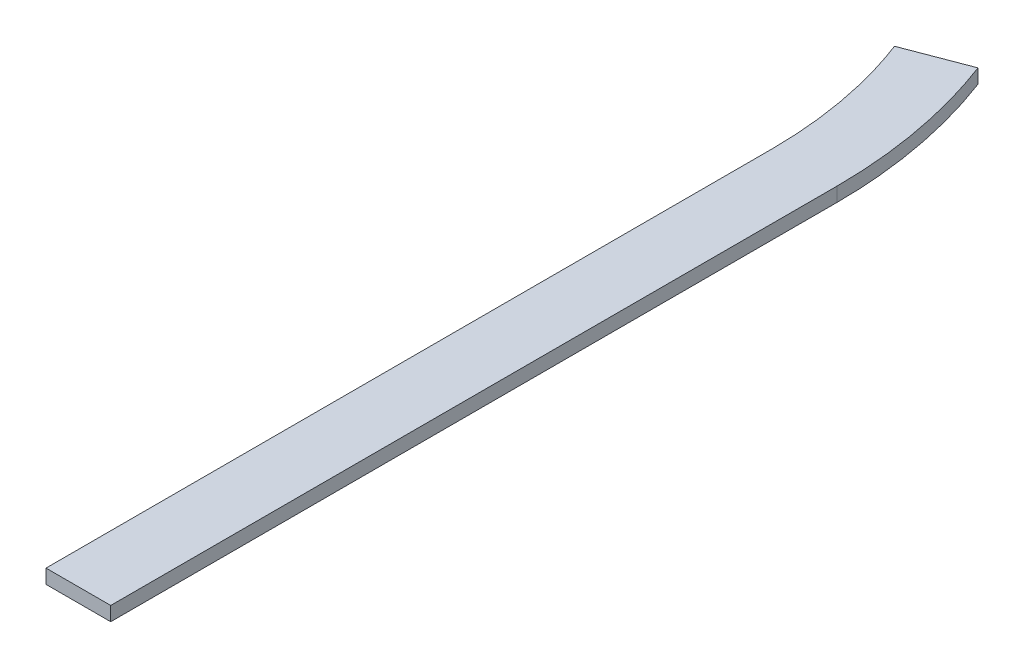
ISO-10303-21;
HEADER;
FILE_DESCRIPTION(('STEP AP214'),'2;1');
FILE_NAME('part.step','',(''),(''),'','','');
FILE_SCHEMA(('AUTOMOTIVE_DESIGN { 1 0 10303 214 1 1 1 1 }'));
ENDSEC;
DATA;
#1=APPLICATION_CONTEXT('core data for automotive mechanical design processes');
#2=APPLICATION_PROTOCOL_DEFINITION('international standard','automotive_design',2000,#1);
#3=PRODUCT_CONTEXT('',#1,'mechanical');
#4=PRODUCT('Part','Part','',(#3));
#5=PRODUCT_RELATED_PRODUCT_CATEGORY('part','',(#4));
#6=PRODUCT_DEFINITION_FORMATION('','',#4);
#7=PRODUCT_DEFINITION_CONTEXT('part definition',#1,'design');
#8=PRODUCT_DEFINITION('design','',#6,#7);
#9=PRODUCT_DEFINITION_SHAPE('','',#8);
#10=(LENGTH_UNIT() NAMED_UNIT(*) SI_UNIT(.MILLI.,.METRE.));
#11=(NAMED_UNIT(*) PLANE_ANGLE_UNIT() SI_UNIT($,.RADIAN.));
#12=(NAMED_UNIT(*) SI_UNIT($,.STERADIAN.) SOLID_ANGLE_UNIT());
#13=UNCERTAINTY_MEASURE_WITH_UNIT(LENGTH_MEASURE(1.E-05),#10,'distance_accuracy_value','');
#14=(GEOMETRIC_REPRESENTATION_CONTEXT(3) GLOBAL_UNCERTAINTY_ASSIGNED_CONTEXT((#13)) GLOBAL_UNIT_ASSIGNED_CONTEXT((#10,
#11,#12)) REPRESENTATION_CONTEXT('',''));
#15=CARTESIAN_POINT('',(0.,0.,0.));
#16=DIRECTION('',(0.,0.,1.));
#17=DIRECTION('',(1.,0.,0.));
#18=AXIS2_PLACEMENT_3D('',#15,#16,#17);
#19=CARTESIAN_POINT('',(206.7634030179,12.51982526687,-73.80424339814));
#20=DIRECTION('',(-4.11807596780088E-05,-0.999999999152071,4.96010211486386E-08));
#21=DIRECTION('',(0.999999999152072,-4.11807596780089E-05,0.));
#22=AXIS2_PLACEMENT_3D('',#19,#20,#21);
#23=PLANE('',#22);
#24=CARTESIAN_POINT('',(205.25,12.51990717558,-68.79760293847));
#25=DIRECTION('',(0.,3.85219138878227E-06,0.99999999999258));
#26=VECTOR('',#25,1.);
#27=LINE('',#24,#26);
#28=CARTESIAN_POINT('',(205.249996809574,12.5198978926762,-68.7976029384695));
#29=VERTEX_POINT('',#28);
#30=CARTESIAN_POINT('',(205.249999997882,12.5200060460964,-24.4496012181494));
#31=VERTEX_POINT('',#30);
#32=EDGE_CURVE('E119',#29,#31,#27,.T.);
#33=ORIENTED_EDGE('',*,*,#32,.F.);
#34=CARTESIAN_POINT('',(205.249993621704,12.5198878385532,-68.7976029384691));
#35=CARTESIAN_POINT('',(205.246957883926,12.5198878473288,-71.1410698714361));
#36=CARTESIAN_POINT('',(204.8211498475,12.5199052680962,-73.4460842067354));
#37=CARTESIAN_POINT('',(204.395440076756,12.5199226848433,-75.7505666032614));
#38=CARTESIAN_POINT('',(203.56073576275,12.5199569499568,-77.9409303013525));
#39=B_SPLINE_CURVE_WITH_KNOTS('',2,(#34,#35,#36,#37,#38),.UNSPECIFIED.,.F.,.F.,(3,2,3),(0.,0.5,
1.),.UNSPECIFIED.);
#40=CARTESIAN_POINT('',(203.560735761714,12.5199320627684,-77.9409303013496));
#41=VERTEX_POINT('',#40);
#42=EDGE_CURVE('E81',#29,#41,#39,.T.);
#43=ORIENTED_EDGE('',*,*,#42,.T.);
#44=CARTESIAN_POINT('',(203.560735762744,12.5199569499568,-77.9409303013564));
#45=DIRECTION('',(0.934447982517215,-3.84989407387837E-05,-0.356099658083715));
#46=VECTOR('',#45,1.);
#47=LINE('',#44,#46);
#48=CARTESIAN_POINT('',(207.25180529488,12.5198038344023,-79.3475239510282));
#49=VERTEX_POINT('',#48);
#50=EDGE_CURVE('E77',#41,#49,#47,.T.);
#51=ORIENTED_EDGE('',*,*,#50,.T.);
#52=CARTESIAN_POINT('',(179.4799540302,12.5209490700172,-68.76422031162));
#53=DIRECTION('',(-4.11807596780088E-05,-0.999999999152071,4.96010211486386E-08));
#54=DIRECTION('',(0.999999273777948,-4.1180789549488E-05,-0.00120446989116063));
#55=AXIS2_PLACEMENT_3D('',#52,#53,#54);
#56=ELLIPSE('',#55,29.7200612394505,29.72006121425);
#57=CARTESIAN_POINT('',(209.199995460566,12.51973506296,-68.800017229113));
#58=VERTEX_POINT('',#57);
#59=EDGE_CURVE('E97',#58,#49,#56,.F.);
#60=ORIENTED_EDGE('',*,*,#59,.F.);
#61=CARTESIAN_POINT('',(209.199993685527,12.5197251744299,-68.8000172291691));
#62=DIRECTION('',(2.04274556717154E-12,4.96010211086371E-08,0.999999999999999));
#63=VECTOR('',#62,1.);
#64=LINE('',#61,#63);
#65=CARTESIAN_POINT('',(209.199998901492,12.5198971364065,-24.4503876668486));
#66=VERTEX_POINT('',#65);
#67=EDGE_CURVE('E106',#58,#66,#64,.T.);
#68=ORIENTED_EDGE('',*,*,#67,.T.);
#69=CARTESIAN_POINT('',(205.2500000013,12.52007801412,-24.4499919373366));
#70=DIRECTION('',(0.999999999738262,-2.28782126459119E-05,2.52003349473531E-07));
#71=VECTOR('',#70,1.);
#72=LINE('',#69,#71);
#73=EDGE_CURVE('E112',#31,#66,#72,.T.);
#74=ORIENTED_EDGE('',*,*,#73,.F.);
#75=EDGE_LOOP('',(#33,#43,#51,#60,#68,#74));
#76=FACE_BOUND('',#75,.T.);
#77=ADVANCED_FACE('F17',(#76),#23,.T.);
#78=CARTESIAN_POINT('',(205.4062705276,12.9513693358,-78.64422712624));
#79=DIRECTION('',(0.356099658181508,0.,0.93444798327302));
#80=DIRECTION('',(0.93444798327302,0.,-0.356099658181508));
#81=AXIS2_PLACEMENT_3D('',#78,#79,#80);
#82=PLANE('',#81);
#83=DIRECTION('',(0.,-1.,0.));
#84=VECTOR('',#83,1.);
#85=CARTESIAN_POINT('',(203.560735760675,-54.,-77.9409303013403));
#86=LINE('',#85,#84);
#87=CARTESIAN_POINT('',(203.560735760675,13.3829195044661,-77.9409303013386));
#88=VERTEX_POINT('',#87);
#89=EDGE_CURVE('E74',#41,#88,#86,.F.);
#90=ORIENTED_EDGE('',*,*,#89,.T.);
#91=DIRECTION('',(-0.934447983055316,-2.15278358386408E-05,0.35609965810206));
#92=VECTOR('',#91,1.);
#93=CARTESIAN_POINT('',(207.251805294403,13.3830045394177,-79.3475239510849));
#94=LINE('',#93,#92);
#95=CARTESIAN_POINT('',(207.251805294665,13.3830045394177,-79.3475239509943));
#96=VERTEX_POINT('',#95);
#97=EDGE_CURVE('E70',#96,#88,#94,.T.);
#98=ORIENTED_EDGE('',*,*,#97,.F.);
#99=DIRECTION('',(0.,-1.,0.));
#100=VECTOR('',#99,1.);
#101=CARTESIAN_POINT('',(207.251805294729,-54.,-79.3475239508279));
#102=LINE('',#101,#100);
#103=EDGE_CURVE('E95',#49,#96,#102,.F.);
#104=ORIENTED_EDGE('',*,*,#103,.F.);
#105=ORIENTED_EDGE('',*,*,#50,.F.);
#106=EDGE_LOOP('',(#90,#98,#104,#105));
#107=FACE_BOUND('',#106,.T.);
#108=ADVANCED_FACE('F76',(#107),#82,.F.);
#109=CARTESIAN_POINT('',(179.4799540302,-54.,-68.76422031162));
#110=DIRECTION('',(0.,-1.,0.));
#111=DIRECTION('',(0.,0.,-1.));
#112=AXIS2_PLACEMENT_3D('',#109,#110,#111);
#113=CYLINDRICAL_SURFACE('',#112,25.77006121425);
#114=ORIENTED_EDGE('',*,*,#42,.F.);
#115=CARTESIAN_POINT('',(205.25,13.38286193823,-68.79962073198));
#116=DIRECTION('',(0.,-0.999997266333031,0.00233823148251143));
#117=VECTOR('',#116,1.);
#118=LINE('',#115,#117);
#119=CARTESIAN_POINT('',(205.249995237576,13.3828724205105,-68.7996207323572));
#120=VERTEX_POINT('',#119);
#121=EDGE_CURVE('E80',#120,#29,#118,.T.);
#122=ORIENTED_EDGE('',*,*,#121,.F.);
#123=CARTESIAN_POINT('',(179.4799540302,13.3823647308186,-68.76422031162));
#124=DIRECTION('',(-2.01166427834595E-05,0.999999999768276,7.66605498345281E-06));
#125=DIRECTION('',(-0.934447983056516,-2.15278358384357E-05,0.35609965809891));
#126=AXIS2_PLACEMENT_3D('',#123,#124,#125);
#127=ELLIPSE('',#126,25.7700612202215,25.77006121425);
#128=EDGE_CURVE('E84',#88,#120,#127,.F.);
#129=ORIENTED_EDGE('',*,*,#128,.F.);
#130=ORIENTED_EDGE('',*,*,#89,.F.);
#131=EDGE_LOOP('',(#114,#122,#129,#130));
#132=FACE_BOUND('',#131,.T.);
#133=ADVANCED_FACE('F85',(#132),#113,.F.);
#134=CARTESIAN_POINT('',(205.25,-54.,-68.8));
#135=DIRECTION('',(-1.,0.,0.));
#136=DIRECTION('',(0.,0.,1.));
#137=AXIS2_PLACEMENT_3D('',#134,#135,#136);
#138=PLANE('',#137);
#139=CARTESIAN_POINT('',(205.2500000013,13.38266990497,-24.4499919373366));
#140=DIRECTION('',(0.,-1.,0.));
#141=VECTOR('',#140,1.);
#142=LINE('',#139,#141);
#143=CARTESIAN_POINT('',(205.24999799749,13.3826066162076,-24.449991937852));
#144=VERTEX_POINT('',#143);
#145=EDGE_CURVE('E116',#144,#31,#142,.T.);
#146=ORIENTED_EDGE('',*,*,#145,.F.);
#147=DIRECTION('',(0.,-7.66605498500396E-06,0.999999999970616));
#148=VECTOR('',#147,1.);
#149=CARTESIAN_POINT('',(205.25,13.3829217747221,-73.8042433983734));
#150=LINE('',#149,#148);
#151=EDGE_CURVE('E91',#120,#144,#150,.T.);
#152=ORIENTED_EDGE('',*,*,#151,.F.);
#153=ORIENTED_EDGE('',*,*,#121,.T.);
#154=ORIENTED_EDGE('',*,*,#32,.T.);
#155=EDGE_LOOP('',(#146,#152,#153,#154));
#156=FACE_BOUND('',#155,.T.);
#157=ADVANCED_FACE('F125',(#156),#138,.T.);
#158=CARTESIAN_POINT('',(207.2249999365,12.95154905825,-24.44999143963));
#159=DIRECTION('',(-2.52003349609692E-07,0.,0.999999999999968));
#160=DIRECTION('',(0.999999999999968,0.,2.52003349609692E-07));
#161=AXIS2_PLACEMENT_3D('',#158,#159,#160);
#162=PLANE('',#161);
#163=ORIENTED_EDGE('',*,*,#73,.T.);
#164=CARTESIAN_POINT('',(209.2000000026,12.51998764518,-24.4499909419234));
#165=DIRECTION('',(0.,1.,0.));
#166=VECTOR('',#165,1.);
#167=LINE('',#164,#166);
#168=CARTESIAN_POINT('',(209.200000002203,13.3826536989069,-24.4499914263381));
#169=VERTEX_POINT('',#168);
#170=EDGE_CURVE('E104',#66,#169,#167,.T.);
#171=ORIENTED_EDGE('',*,*,#170,.T.);
#172=DIRECTION('',(-0.999999999797661,-2.01166427840506E-05,0.));
#173=VECTOR('',#172,1.);
#174=CARTESIAN_POINT('',(206.763403025511,13.3825738669047,-24.4499919387096));
#175=LINE('',#174,#173);
#176=EDGE_CURVE('E255',#144,#169,#175,.F.);
#177=ORIENTED_EDGE('',*,*,#176,.F.);
#178=ORIENTED_EDGE('',*,*,#145,.T.);
#179=EDGE_LOOP('',(#163,#171,#177,#178));
#180=FACE_BOUND('',#179,.T.);
#181=ADVANCED_FACE('F144',(#180),#162,.T.);
#182=CARTESIAN_POINT('',(209.2,-54.,-68.8));
#183=DIRECTION('',(-1.,0.,0.));
#184=DIRECTION('',(0.,0.,1.));
#185=AXIS2_PLACEMENT_3D('',#182,#183,#184);
#186=PLANE('',#185);
#187=ORIENTED_EDGE('',*,*,#67,.F.);
#188=CARTESIAN_POINT('',(209.199993686288,13.38299473679,-68.80001722903));
#189=DIRECTION('',(0.,-1.,0.));
#190=VECTOR('',#189,1.);
#191=LINE('',#188,#190);
#192=CARTESIAN_POINT('',(209.199996842798,13.3829788048527,-68.8000172291521));
#193=VERTEX_POINT('',#192);
#194=EDGE_CURVE('E36',#193,#58,#191,.T.);
#195=ORIENTED_EDGE('',*,*,#194,.F.);
#196=DIRECTION('',(1.54215289665011E-10,-7.66605498190167E-06,0.999999999970616));
#197=VECTOR('',#196,1.);
#198=CARTESIAN_POINT('',(209.199999996529,13.383001235461,-73.80424339814));
#199=LINE('',#198,#197);
#200=EDGE_CURVE('E27',#169,#193,#199,.F.);
#201=ORIENTED_EDGE('',*,*,#200,.F.);
#202=ORIENTED_EDGE('',*,*,#170,.F.);
#203=EDGE_LOOP('',(#187,#195,#201,#202));
#204=FACE_BOUND('',#203,.T.);
#205=ADVANCED_FACE('F207',(#204),#186,.F.);
#206=CARTESIAN_POINT('',(179.4799540302,-54.,-68.76422031162));
#207=DIRECTION('',(0.,-1.,0.));
#208=DIRECTION('',(0.,0.,-1.));
#209=AXIS2_PLACEMENT_3D('',#206,#207,#208);
#210=CYLINDRICAL_SURFACE('',#209,29.72006121425);
#211=ORIENTED_EDGE('',*,*,#103,.T.);
#212=CARTESIAN_POINT('',(179.4799540302,13.3823647308186,-68.76422031162));
#213=DIRECTION('',(-2.01166427834595E-05,0.999999999768276,7.66605498345281E-06));
#214=DIRECTION('',(-0.934447983056516,-2.15278358384357E-05,0.35609965809891));
#215=AXIS2_PLACEMENT_3D('',#212,#213,#214);
#216=ELLIPSE('',#215,29.7200612211369,29.72006121425);
#217=EDGE_CURVE('E11',#193,#96,#216,.T.);
#218=ORIENTED_EDGE('',*,*,#217,.F.);
#219=ORIENTED_EDGE('',*,*,#194,.T.);
#220=ORIENTED_EDGE('',*,*,#59,.T.);
#221=EDGE_LOOP('',(#211,#218,#219,#220));
#222=FACE_BOUND('',#221,.T.);
#223=ADVANCED_FACE('F216',(#222),#210,.T.);
#224=CARTESIAN_POINT('',(206.7634030179,13.38295221931,-73.80424339814));
#225=DIRECTION('',(-2.01166427834595E-05,0.999999999768276,7.66605498345281E-06));
#226=DIRECTION('',(-0.999999999797661,-2.01166427840506E-05,0.));
#227=AXIS2_PLACEMENT_3D('',#224,#225,#226);
#228=PLANE('',#227);
#229=ORIENTED_EDGE('',*,*,#200,.T.);
#230=ORIENTED_EDGE('',*,*,#217,.T.);
#231=ORIENTED_EDGE('',*,*,#97,.T.);
#232=ORIENTED_EDGE('',*,*,#128,.T.);
#233=ORIENTED_EDGE('',*,*,#151,.T.);
#234=ORIENTED_EDGE('',*,*,#176,.T.);
#235=EDGE_LOOP('',(#229,#230,#231,#232,#233,#234));
#236=FACE_BOUND('',#235,.T.);
#237=ADVANCED_FACE('F94',(#236),#228,.T.);
#238=CLOSED_SHELL('',(#77,#108,#133,#157,#181,#205,#223,#237));
#239=MANIFOLD_SOLID_BREP('B1',#238);
#240=ADVANCED_BREP_SHAPE_REPRESENTATION('',(#18,#239),#14);
#241=SHAPE_DEFINITION_REPRESENTATION(#9,#240);
ENDSEC;
END-ISO-10303-21;
